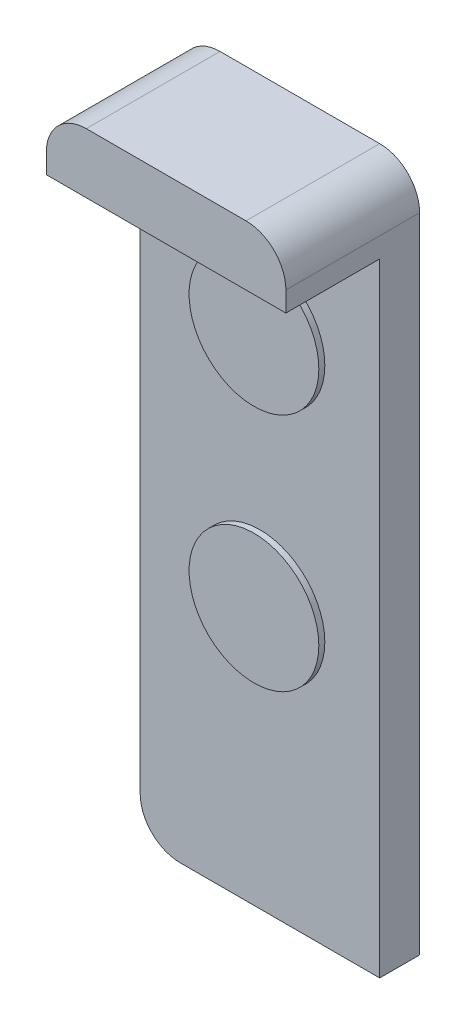
ISO-10303-21;
HEADER;
FILE_DESCRIPTION(('STEP AP214'),'2;1');
FILE_NAME('part.step','',(''),(''),'','','');
FILE_SCHEMA(('AUTOMOTIVE_DESIGN { 1 0 10303 214 1 1 1 1 }'));
ENDSEC;
DATA;
#1=APPLICATION_CONTEXT('core data for automotive mechanical design processes');
#2=APPLICATION_PROTOCOL_DEFINITION('international standard','automotive_design',2000,#1);
#3=PRODUCT_CONTEXT('',#1,'mechanical');
#4=PRODUCT('Part','Part','',(#3));
#5=PRODUCT_RELATED_PRODUCT_CATEGORY('part','',(#4));
#6=PRODUCT_DEFINITION_FORMATION('','',#4);
#7=PRODUCT_DEFINITION_CONTEXT('part definition',#1,'design');
#8=PRODUCT_DEFINITION('design','',#6,#7);
#9=PRODUCT_DEFINITION_SHAPE('','',#8);
#10=(LENGTH_UNIT() NAMED_UNIT(*) SI_UNIT(.MILLI.,.METRE.));
#11=(NAMED_UNIT(*) PLANE_ANGLE_UNIT() SI_UNIT($,.RADIAN.));
#12=(NAMED_UNIT(*) SI_UNIT($,.STERADIAN.) SOLID_ANGLE_UNIT());
#13=UNCERTAINTY_MEASURE_WITH_UNIT(LENGTH_MEASURE(1.E-05),#10,'distance_accuracy_value','');
#14=(GEOMETRIC_REPRESENTATION_CONTEXT(3) GLOBAL_UNCERTAINTY_ASSIGNED_CONTEXT((#13)) GLOBAL_UNIT_ASSIGNED_CONTEXT((#10,
#11,#12)) REPRESENTATION_CONTEXT('',''));
#15=CARTESIAN_POINT('',(0.,0.,0.));
#16=DIRECTION('',(0.,0.,1.));
#17=DIRECTION('',(1.,0.,0.));
#18=AXIS2_PLACEMENT_3D('',#15,#16,#17);
#19=CARTESIAN_POINT('',(0.,0.,2.));
#20=DIRECTION('',(0.,0.,1.));
#21=DIRECTION('',(1.,0.,0.));
#22=AXIS2_PLACEMENT_3D('',#19,#20,#21);
#23=PLANE('',#22);
#24=CARTESIAN_POINT('',(2.23380094769014,-0.608450704225353,2.));
#25=DIRECTION('',(0.,0.,1.));
#26=DIRECTION('',(1.,0.,0.));
#27=AXIS2_PLACEMENT_3D('',#24,#25,#26);
#28=CIRCLE('',#27,3.25);
#29=CARTESIAN_POINT('',(5.48380094769013,-0.608450704225353,2.));
#30=VERTEX_POINT('',#29);
#31=EDGE_CURVE('E129',#30,#30,#28,.T.);
#32=ORIENTED_EDGE('',*,*,#31,.F.);
#33=EDGE_LOOP('',(#32));
#34=FACE_BOUND('',#33,.T.);
#35=CARTESIAN_POINT('',(2.23380094769014,11.3915492957746,2.));
#36=DIRECTION('',(0.,0.,1.));
#37=DIRECTION('',(1.,0.,0.));
#38=AXIS2_PLACEMENT_3D('',#35,#36,#37);
#39=CIRCLE('',#38,3.25);
#40=CARTESIAN_POINT('',(5.48380094769013,11.3915492957746,2.));
#41=VERTEX_POINT('',#40);
#42=EDGE_CURVE('E139',#41,#41,#39,.T.);
#43=ORIENTED_EDGE('',*,*,#42,.F.);
#44=EDGE_LOOP('',(#43));
#45=FACE_BOUND('',#44,.T.);
#46=DIRECTION('',(0.,-1.,0.));
#47=VECTOR('',#46,1.);
#48=CARTESIAN_POINT('',(-3.76619905230986,20.3915492957746,2.));
#49=LINE('',#48,#47);
#50=CARTESIAN_POINT('',(-3.76619905230986,17.3915492957747,2.));
#51=VERTEX_POINT('',#50);
#52=CARTESIAN_POINT('',(-3.76619905230986,-11.8084507042254,2.));
#53=VERTEX_POINT('',#52);
#54=EDGE_CURVE('E128',#51,#53,#49,.T.);
#55=ORIENTED_EDGE('',*,*,#54,.T.);
#56=CARTESIAN_POINT('',(-1.76619905230986,-11.8084507042254,2.));
#57=DIRECTION('',(0.,0.,1.));
#58=DIRECTION('',(1.,0.,0.));
#59=AXIS2_PLACEMENT_3D('',#56,#57,#58);
#60=CIRCLE('',#59,2.);
#61=CARTESIAN_POINT('',(-1.76619905230986,-13.8084507042254,2.));
#62=VERTEX_POINT('',#61);
#63=EDGE_CURVE('E11',#53,#62,#60,.T.);
#64=ORIENTED_EDGE('',*,*,#63,.T.);
#65=DIRECTION('',(1.,0.,0.));
#66=VECTOR('',#65,1.);
#67=CARTESIAN_POINT('',(-3.76619905230986,-13.8084507042254,2.));
#68=LINE('',#67,#66);
#69=CARTESIAN_POINT('',(8.23380094769014,-13.8084507042254,2.));
#70=VERTEX_POINT('',#69);
#71=EDGE_CURVE('E148',#62,#70,#68,.T.);
#72=ORIENTED_EDGE('',*,*,#71,.T.);
#73=DIRECTION('',(0.,1.,0.));
#74=VECTOR('',#73,1.);
#75=CARTESIAN_POINT('',(8.23380094769014,20.3915492957746,2.));
#76=LINE('',#75,#74);
#77=CARTESIAN_POINT('',(8.23380094769014,17.3915492957747,2.));
#78=VERTEX_POINT('',#77);
#79=EDGE_CURVE('E151',#70,#78,#76,.T.);
#80=ORIENTED_EDGE('',*,*,#79,.T.);
#81=DIRECTION('',(1.,0.,0.));
#82=VECTOR('',#81,1.);
#83=CARTESIAN_POINT('',(-3.76619905230986,17.3915492957747,2.));
#84=LINE('',#83,#82);
#85=EDGE_CURVE('E115',#51,#78,#84,.T.);
#86=ORIENTED_EDGE('',*,*,#85,.F.);
#87=EDGE_LOOP('',(#55,#64,#72,#80,#86));
#88=FACE_BOUND('',#87,.T.);
#89=ADVANCED_FACE('F33',(#34,#45,#88),#23,.T.);
#90=CARTESIAN_POINT('',(-3.76619905230986,20.3915492957746,2.));
#91=DIRECTION('',(1.,0.,0.));
#92=DIRECTION('',(0.,1.,0.));
#93=AXIS2_PLACEMENT_3D('',#90,#91,#92);
#94=PLANE('',#93);
#95=DIRECTION('',(0.,-1.,0.));
#96=VECTOR('',#95,1.);
#97=CARTESIAN_POINT('',(-3.76619905230986,20.3915492957746,6.7));
#98=LINE('',#97,#96);
#99=CARTESIAN_POINT('',(-3.76619905230986,18.3915492957746,6.7));
#100=VERTEX_POINT('',#99);
#101=CARTESIAN_POINT('',(-3.76619905230986,17.3915492957747,6.7));
#102=VERTEX_POINT('',#101);
#103=EDGE_CURVE('E103',#100,#102,#98,.T.);
#104=ORIENTED_EDGE('',*,*,#103,.F.);
#105=DIRECTION('',(0.,0.,-1.));
#106=VECTOR('',#105,1.);
#107=CARTESIAN_POINT('',(-3.76619905230986,18.3915492957746,2.));
#108=LINE('',#107,#106);
#109=CARTESIAN_POINT('',(-3.76619905230986,18.3915492957746,0.));
#110=VERTEX_POINT('',#109);
#111=EDGE_CURVE('E181',#100,#110,#108,.T.);
#112=ORIENTED_EDGE('',*,*,#111,.T.);
#113=DIRECTION('',(0.,-1.,0.));
#114=VECTOR('',#113,1.);
#115=CARTESIAN_POINT('',(-3.76619905230986,20.3915492957746,0.));
#116=LINE('',#115,#114);
#117=CARTESIAN_POINT('',(-3.76619905230986,-11.8084507042254,0.));
#118=VERTEX_POINT('',#117);
#119=EDGE_CURVE('E144',#110,#118,#116,.T.);
#120=ORIENTED_EDGE('',*,*,#119,.T.);
#121=DIRECTION('',(0.,0.,-1.));
#122=VECTOR('',#121,1.);
#123=CARTESIAN_POINT('',(-3.76619905230986,-11.8084507042254,2.));
#124=LINE('',#123,#122);
#125=EDGE_CURVE('E54',#118,#53,#124,.F.);
#126=ORIENTED_EDGE('',*,*,#125,.T.);
#127=ORIENTED_EDGE('',*,*,#54,.F.);
#128=DIRECTION('',(0.,0.,-1.));
#129=VECTOR('',#128,1.);
#130=CARTESIAN_POINT('',(-3.76619905230986,17.3915492957747,6.7));
#131=LINE('',#130,#129);
#132=EDGE_CURVE('E121',#102,#51,#131,.T.);
#133=ORIENTED_EDGE('',*,*,#132,.F.);
#134=EDGE_LOOP('',(#104,#112,#120,#126,#127,#133));
#135=FACE_BOUND('',#134,.T.);
#136=ADVANCED_FACE('F127',(#135),#94,.F.);
#137=CARTESIAN_POINT('',(-3.76619905230986,-13.8084507042254,2.));
#138=DIRECTION('',(0.,1.,0.));
#139=DIRECTION('',(-1.,0.,0.));
#140=AXIS2_PLACEMENT_3D('',#137,#138,#139);
#141=PLANE('',#140);
#142=ORIENTED_EDGE('',*,*,#71,.F.);
#143=DIRECTION('',(0.,0.,-1.));
#144=VECTOR('',#143,1.);
#145=CARTESIAN_POINT('',(-1.76619905230986,-13.8084507042254,2.));
#146=LINE('',#145,#144);
#147=CARTESIAN_POINT('',(-1.76619905230986,-13.8084507042254,0.));
#148=VERTEX_POINT('',#147);
#149=EDGE_CURVE('E41',#62,#148,#146,.T.);
#150=ORIENTED_EDGE('',*,*,#149,.T.);
#151=DIRECTION('',(1.,0.,0.));
#152=VECTOR('',#151,1.);
#153=CARTESIAN_POINT('',(-3.76619905230986,-13.8084507042254,0.));
#154=LINE('',#153,#152);
#155=CARTESIAN_POINT('',(8.23380094769014,-13.8084507042254,0.));
#156=VERTEX_POINT('',#155);
#157=EDGE_CURVE('E155',#148,#156,#154,.T.);
#158=ORIENTED_EDGE('',*,*,#157,.T.);
#159=DIRECTION('',(0.,0.,-1.));
#160=VECTOR('',#159,1.);
#161=CARTESIAN_POINT('',(8.23380094769014,-13.8084507042254,2.));
#162=LINE('',#161,#160);
#163=EDGE_CURVE('E153',#70,#156,#162,.T.);
#164=ORIENTED_EDGE('',*,*,#163,.F.);
#165=EDGE_LOOP('',(#142,#150,#158,#164));
#166=FACE_BOUND('',#165,.T.);
#167=ADVANCED_FACE('F186',(#166),#141,.F.);
#168=CARTESIAN_POINT('',(8.23380094769014,20.3915492957746,2.));
#169=DIRECTION('',(-1.,0.,0.));
#170=DIRECTION('',(0.,0.,1.));
#171=AXIS2_PLACEMENT_3D('',#168,#169,#170);
#172=PLANE('',#171);
#173=DIRECTION('',(0.,1.,0.));
#174=VECTOR('',#173,1.);
#175=CARTESIAN_POINT('',(8.23380094769014,20.3915492957746,0.));
#176=LINE('',#175,#174);
#177=CARTESIAN_POINT('',(8.23380094769014,18.3915492957746,0.));
#178=VERTEX_POINT('',#177);
#179=EDGE_CURVE('E157',#156,#178,#176,.T.);
#180=ORIENTED_EDGE('',*,*,#179,.T.);
#181=DIRECTION('',(0.,0.,-1.));
#182=VECTOR('',#181,1.);
#183=CARTESIAN_POINT('',(8.23380094769014,18.3915492957746,2.));
#184=LINE('',#183,#182);
#185=CARTESIAN_POINT('',(8.23380094769014,18.3915492957746,6.7));
#186=VERTEX_POINT('',#185);
#187=EDGE_CURVE('E175',#178,#186,#184,.F.);
#188=ORIENTED_EDGE('',*,*,#187,.T.);
#189=DIRECTION('',(0.,1.,0.));
#190=VECTOR('',#189,1.);
#191=CARTESIAN_POINT('',(8.23380094769014,20.3915492957746,6.7));
#192=LINE('',#191,#190);
#193=CARTESIAN_POINT('',(8.23380094769014,17.3915492957747,6.7));
#194=VERTEX_POINT('',#193);
#195=EDGE_CURVE('E125',#194,#186,#192,.T.);
#196=ORIENTED_EDGE('',*,*,#195,.F.);
#197=DIRECTION('',(0.,0.,-1.));
#198=VECTOR('',#197,1.);
#199=CARTESIAN_POINT('',(8.23380094769014,17.3915492957747,6.7));
#200=LINE('',#199,#198);
#201=EDGE_CURVE('E123',#194,#78,#200,.T.);
#202=ORIENTED_EDGE('',*,*,#201,.T.);
#203=ORIENTED_EDGE('',*,*,#79,.F.);
#204=ORIENTED_EDGE('',*,*,#163,.T.);
#205=EDGE_LOOP('',(#180,#188,#196,#202,#203,#204));
#206=FACE_BOUND('',#205,.T.);
#207=ADVANCED_FACE('F196',(#206),#172,.F.);
#208=CARTESIAN_POINT('',(-3.76619905230986,20.3915492957746,2.));
#209=DIRECTION('',(0.,-1.,0.));
#210=DIRECTION('',(0.,0.,-1.));
#211=AXIS2_PLACEMENT_3D('',#208,#209,#210);
#212=PLANE('',#211);
#213=DIRECTION('',(-1.,0.,0.));
#214=VECTOR('',#213,1.);
#215=CARTESIAN_POINT('',(-3.76619905230986,20.3915492957746,6.7));
#216=LINE('',#215,#214);
#217=CARTESIAN_POINT('',(6.23380094769014,20.3915492957746,6.7));
#218=VERTEX_POINT('',#217);
#219=CARTESIAN_POINT('',(-1.76619905230986,20.3915492957746,6.7));
#220=VERTEX_POINT('',#219);
#221=EDGE_CURVE('E134',#218,#220,#216,.T.);
#222=ORIENTED_EDGE('',*,*,#221,.F.);
#223=DIRECTION('',(0.,0.,-1.));
#224=VECTOR('',#223,1.);
#225=CARTESIAN_POINT('',(6.23380094769014,20.3915492957746,2.));
#226=LINE('',#225,#224);
#227=CARTESIAN_POINT('',(6.23380094769014,20.3915492957746,0.));
#228=VERTEX_POINT('',#227);
#229=EDGE_CURVE('E166',#218,#228,#226,.T.);
#230=ORIENTED_EDGE('',*,*,#229,.T.);
#231=DIRECTION('',(-1.,0.,0.));
#232=VECTOR('',#231,1.);
#233=CARTESIAN_POINT('',(-3.76619905230986,20.3915492957746,0.));
#234=LINE('',#233,#232);
#235=CARTESIAN_POINT('',(-1.76619905230986,20.3915492957746,0.));
#236=VERTEX_POINT('',#235);
#237=EDGE_CURVE('E149',#228,#236,#234,.T.);
#238=ORIENTED_EDGE('',*,*,#237,.T.);
#239=DIRECTION('',(0.,0.,-1.));
#240=VECTOR('',#239,1.);
#241=CARTESIAN_POINT('',(-1.76619905230986,20.3915492957746,2.));
#242=LINE('',#241,#240);
#243=EDGE_CURVE('E164',#236,#220,#242,.F.);
#244=ORIENTED_EDGE('',*,*,#243,.T.);
#245=EDGE_LOOP('',(#222,#230,#238,#244));
#246=FACE_BOUND('',#245,.T.);
#247=ADVANCED_FACE('F204',(#246),#212,.F.);
#248=CARTESIAN_POINT('',(0.,0.,0.));
#249=DIRECTION('',(0.,0.,1.));
#250=DIRECTION('',(1.,0.,0.));
#251=AXIS2_PLACEMENT_3D('',#248,#249,#250);
#252=PLANE('',#251);
#253=ORIENTED_EDGE('',*,*,#237,.F.);
#254=CARTESIAN_POINT('',(6.23380094769014,18.3915492957746,0.));
#255=DIRECTION('',(0.,0.,1.));
#256=DIRECTION('',(1.,0.,0.));
#257=AXIS2_PLACEMENT_3D('',#254,#255,#256);
#258=CIRCLE('',#257,2.);
#259=EDGE_CURVE('E173',#228,#178,#258,.F.);
#260=ORIENTED_EDGE('',*,*,#259,.T.);
#261=ORIENTED_EDGE('',*,*,#179,.F.);
#262=ORIENTED_EDGE('',*,*,#157,.F.);
#263=CARTESIAN_POINT('',(-1.76619905230986,-11.8084507042254,0.));
#264=DIRECTION('',(0.,0.,1.));
#265=DIRECTION('',(1.,0.,0.));
#266=AXIS2_PLACEMENT_3D('',#263,#264,#265);
#267=CIRCLE('',#266,2.);
#268=EDGE_CURVE('E169',#148,#118,#267,.F.);
#269=ORIENTED_EDGE('',*,*,#268,.T.);
#270=ORIENTED_EDGE('',*,*,#119,.F.);
#271=CARTESIAN_POINT('',(-1.76619905230986,18.3915492957746,0.));
#272=DIRECTION('',(0.,0.,1.));
#273=DIRECTION('',(1.,0.,0.));
#274=AXIS2_PLACEMENT_3D('',#271,#272,#273);
#275=CIRCLE('',#274,2.);
#276=EDGE_CURVE('E171',#110,#236,#275,.F.);
#277=ORIENTED_EDGE('',*,*,#276,.T.);
#278=EDGE_LOOP('',(#253,#260,#261,#262,#269,#270,#277));
#279=FACE_BOUND('',#278,.T.);
#280=ADVANCED_FACE('F192',(#279),#252,.F.);
#281=CARTESIAN_POINT('',(2.23380094769014,11.3915492957746,2.3));
#282=DIRECTION('',(0.,0.,-1.));
#283=DIRECTION('',(-1.,0.,0.));
#284=AXIS2_PLACEMENT_3D('',#281,#282,#283);
#285=CYLINDRICAL_SURFACE('',#284,3.25);
#286=CARTESIAN_POINT('',(2.23380094769014,11.3915492957746,2.3));
#287=DIRECTION('',(0.,0.,1.));
#288=DIRECTION('',(1.,0.,0.));
#289=AXIS2_PLACEMENT_3D('',#286,#287,#288);
#290=CIRCLE('',#289,3.25);
#291=CARTESIAN_POINT('',(5.48380094769013,11.3915492957746,2.3));
#292=VERTEX_POINT('',#291);
#293=EDGE_CURVE('E141',#292,#292,#290,.T.);
#294=ORIENTED_EDGE('',*,*,#293,.F.);
#295=EDGE_LOOP('',(#294));
#296=FACE_BOUND('',#295,.T.);
#297=ORIENTED_EDGE('',*,*,#42,.T.);
#298=EDGE_LOOP('',(#297));
#299=FACE_BOUND('',#298,.T.);
#300=ADVANCED_FACE('F220',(#296,#299),#285,.T.);
#301=CARTESIAN_POINT('',(2.23380094769014,11.3915492957746,2.3));
#302=DIRECTION('',(0.,0.,1.));
#303=DIRECTION('',(1.,0.,0.));
#304=AXIS2_PLACEMENT_3D('',#301,#302,#303);
#305=PLANE('',#304);
#306=ORIENTED_EDGE('',*,*,#293,.T.);
#307=EDGE_LOOP('',(#306));
#308=FACE_BOUND('',#307,.T.);
#309=ADVANCED_FACE('F304',(#308),#305,.T.);
#310=CARTESIAN_POINT('',(2.23380094769014,-0.608450704225353,2.3));
#311=DIRECTION('',(0.,0.,-1.));
#312=DIRECTION('',(-1.,0.,0.));
#313=AXIS2_PLACEMENT_3D('',#310,#311,#312);
#314=CYLINDRICAL_SURFACE('',#313,3.25);
#315=CARTESIAN_POINT('',(2.23380094769014,-0.608450704225353,2.3));
#316=DIRECTION('',(0.,0.,1.));
#317=DIRECTION('',(1.,0.,0.));
#318=AXIS2_PLACEMENT_3D('',#315,#316,#317);
#319=CIRCLE('',#318,3.25);
#320=CARTESIAN_POINT('',(5.48380094769013,-0.608450704225353,2.3));
#321=VERTEX_POINT('',#320);
#322=EDGE_CURVE('E132',#321,#321,#319,.T.);
#323=ORIENTED_EDGE('',*,*,#322,.F.);
#324=EDGE_LOOP('',(#323));
#325=FACE_BOUND('',#324,.T.);
#326=ORIENTED_EDGE('',*,*,#31,.T.);
#327=EDGE_LOOP('',(#326));
#328=FACE_BOUND('',#327,.T.);
#329=ADVANCED_FACE('F295',(#325,#328),#314,.T.);
#330=CARTESIAN_POINT('',(2.23380094769014,-0.608450704225353,2.3));
#331=DIRECTION('',(0.,0.,1.));
#332=DIRECTION('',(1.,0.,0.));
#333=AXIS2_PLACEMENT_3D('',#330,#331,#332);
#334=PLANE('',#333);
#335=ORIENTED_EDGE('',*,*,#322,.T.);
#336=EDGE_LOOP('',(#335));
#337=FACE_BOUND('',#336,.T.);
#338=ADVANCED_FACE('F289',(#337),#334,.T.);
#339=CARTESIAN_POINT('',(-3.76619905230986,17.3915492957747,6.7));
#340=DIRECTION('',(0.,1.,0.));
#341=DIRECTION('',(0.,0.,1.));
#342=AXIS2_PLACEMENT_3D('',#339,#340,#341);
#343=PLANE('',#342);
#344=ORIENTED_EDGE('',*,*,#85,.T.);
#345=ORIENTED_EDGE('',*,*,#201,.F.);
#346=DIRECTION('',(1.,0.,0.));
#347=VECTOR('',#346,1.);
#348=CARTESIAN_POINT('',(-3.76619905230986,17.3915492957747,6.7));
#349=LINE('',#348,#347);
#350=EDGE_CURVE('E107',#102,#194,#349,.T.);
#351=ORIENTED_EDGE('',*,*,#350,.F.);
#352=ORIENTED_EDGE('',*,*,#132,.T.);
#353=EDGE_LOOP('',(#344,#345,#351,#352));
#354=FACE_BOUND('',#353,.T.);
#355=ADVANCED_FACE('F120',(#354),#343,.F.);
#356=CARTESIAN_POINT('',(0.,0.,6.7));
#357=DIRECTION('',(0.,0.,1.));
#358=DIRECTION('',(1.,0.,0.));
#359=AXIS2_PLACEMENT_3D('',#356,#357,#358);
#360=PLANE('',#359);
#361=ORIENTED_EDGE('',*,*,#195,.T.);
#362=CARTESIAN_POINT('',(6.23380094769014,18.3915492957746,6.7));
#363=DIRECTION('',(0.,0.,1.));
#364=DIRECTION('',(1.,0.,0.));
#365=AXIS2_PLACEMENT_3D('',#362,#363,#364);
#366=CIRCLE('',#365,2.);
#367=EDGE_CURVE('E178',#186,#218,#366,.T.);
#368=ORIENTED_EDGE('',*,*,#367,.T.);
#369=ORIENTED_EDGE('',*,*,#221,.T.);
#370=CARTESIAN_POINT('',(-1.76619905230986,18.3915492957746,6.7));
#371=DIRECTION('',(0.,0.,1.));
#372=DIRECTION('',(1.,0.,0.));
#373=AXIS2_PLACEMENT_3D('',#370,#371,#372);
#374=CIRCLE('',#373,2.);
#375=EDGE_CURVE('E111',#220,#100,#374,.T.);
#376=ORIENTED_EDGE('',*,*,#375,.T.);
#377=ORIENTED_EDGE('',*,*,#103,.T.);
#378=ORIENTED_EDGE('',*,*,#350,.T.);
#379=EDGE_LOOP('',(#361,#368,#369,#376,#377,#378));
#380=FACE_BOUND('',#379,.T.);
#381=ADVANCED_FACE('F106',(#380),#360,.T.);
#382=CARTESIAN_POINT('',(6.23380094769014,18.3915492957746,2.));
#383=DIRECTION('',(0.,0.,-1.));
#384=DIRECTION('',(-1.,0.,0.));
#385=AXIS2_PLACEMENT_3D('',#382,#383,#384);
#386=CYLINDRICAL_SURFACE('',#385,2.);
#387=ORIENTED_EDGE('',*,*,#367,.F.);
#388=ORIENTED_EDGE('',*,*,#187,.F.);
#389=ORIENTED_EDGE('',*,*,#259,.F.);
#390=ORIENTED_EDGE('',*,*,#229,.F.);
#391=EDGE_LOOP('',(#387,#388,#389,#390));
#392=FACE_BOUND('',#391,.T.);
#393=ADVANCED_FACE('F200',(#392),#386,.T.);
#394=CARTESIAN_POINT('',(-1.76619905230986,18.3915492957746,2.));
#395=DIRECTION('',(0.,0.,-1.));
#396=DIRECTION('',(-1.,0.,0.));
#397=AXIS2_PLACEMENT_3D('',#394,#395,#396);
#398=CYLINDRICAL_SURFACE('',#397,2.);
#399=ORIENTED_EDGE('',*,*,#375,.F.);
#400=ORIENTED_EDGE('',*,*,#243,.F.);
#401=ORIENTED_EDGE('',*,*,#276,.F.);
#402=ORIENTED_EDGE('',*,*,#111,.F.);
#403=EDGE_LOOP('',(#399,#400,#401,#402));
#404=FACE_BOUND('',#403,.T.);
#405=ADVANCED_FACE('F231',(#404),#398,.T.);
#406=CARTESIAN_POINT('',(-1.76619905230986,-11.8084507042254,2.));
#407=DIRECTION('',(0.,0.,-1.));
#408=DIRECTION('',(-1.,0.,0.));
#409=AXIS2_PLACEMENT_3D('',#406,#407,#408);
#410=CYLINDRICAL_SURFACE('',#409,2.);
#411=ORIENTED_EDGE('',*,*,#63,.F.);
#412=ORIENTED_EDGE('',*,*,#125,.F.);
#413=ORIENTED_EDGE('',*,*,#268,.F.);
#414=ORIENTED_EDGE('',*,*,#149,.F.);
#415=EDGE_LOOP('',(#411,#412,#413,#414));
#416=FACE_BOUND('',#415,.T.);
#417=ADVANCED_FACE('F35',(#416),#410,.T.);
#418=CLOSED_SHELL('',(#89,#136,#167,#207,#247,#280,#300,#309,#329,#338,#355,#381,#393,#405,#417));
#419=MANIFOLD_SOLID_BREP('B2',#418);
#420=ADVANCED_BREP_SHAPE_REPRESENTATION('',(#18,#419),#14);
#421=SHAPE_DEFINITION_REPRESENTATION(#9,#420);
ENDSEC;
END-ISO-10303-21;
